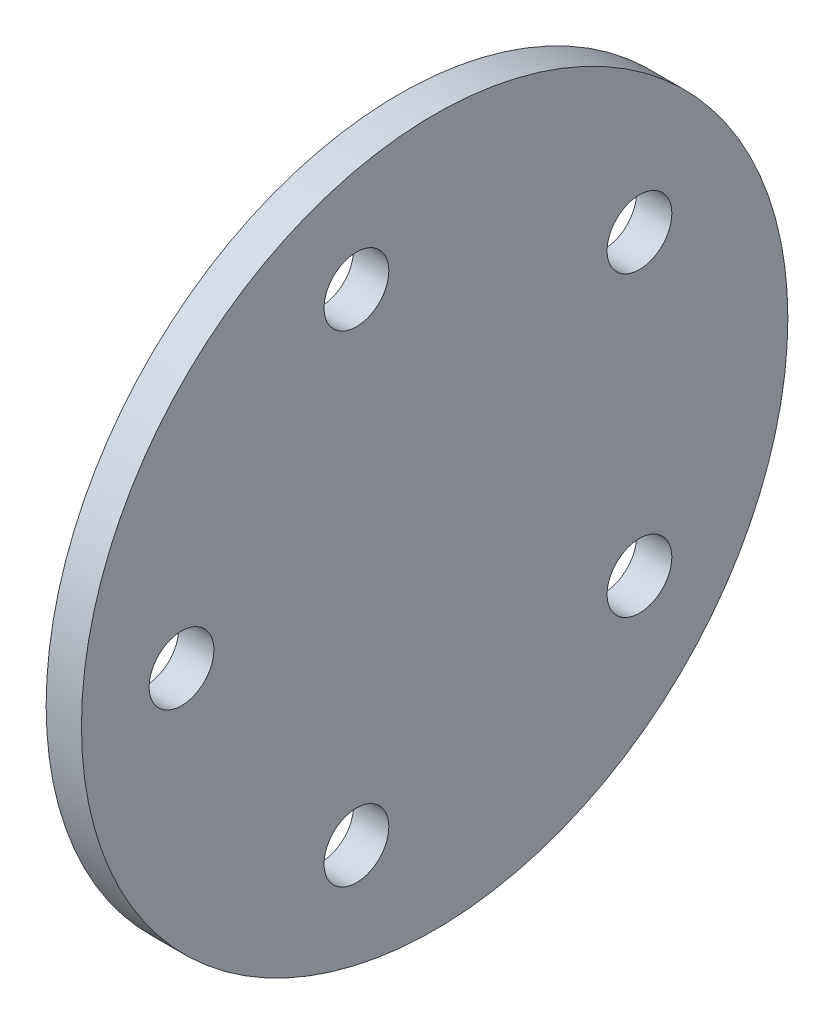
ISO-10303-21;
HEADER;
FILE_DESCRIPTION(('STEP AP214'),'2;1');
FILE_NAME('part.step','',(''),(''),'','','');
FILE_SCHEMA(('AUTOMOTIVE_DESIGN { 1 0 10303 214 1 1 1 1 }'));
ENDSEC;
DATA;
#1=APPLICATION_CONTEXT('core data for automotive mechanical design processes');
#2=APPLICATION_PROTOCOL_DEFINITION('international standard','automotive_design',2000,#1);
#3=PRODUCT_CONTEXT('',#1,'mechanical');
#4=PRODUCT('Part','Part','',(#3));
#5=PRODUCT_RELATED_PRODUCT_CATEGORY('part','',(#4));
#6=PRODUCT_DEFINITION_FORMATION('','',#4);
#7=PRODUCT_DEFINITION_CONTEXT('part definition',#1,'design');
#8=PRODUCT_DEFINITION('design','',#6,#7);
#9=PRODUCT_DEFINITION_SHAPE('','',#8);
#10=(LENGTH_UNIT() NAMED_UNIT(*) SI_UNIT(.MILLI.,.METRE.));
#11=(NAMED_UNIT(*) PLANE_ANGLE_UNIT() SI_UNIT($,.RADIAN.));
#12=(NAMED_UNIT(*) SI_UNIT($,.STERADIAN.) SOLID_ANGLE_UNIT());
#13=UNCERTAINTY_MEASURE_WITH_UNIT(LENGTH_MEASURE(1.E-05),#10,'distance_accuracy_value','');
#14=(GEOMETRIC_REPRESENTATION_CONTEXT(3) GLOBAL_UNCERTAINTY_ASSIGNED_CONTEXT((#13)) GLOBAL_UNIT_ASSIGNED_CONTEXT((#10,
#11,#12)) REPRESENTATION_CONTEXT('',''));
#15=CARTESIAN_POINT('',(0.,0.,0.));
#16=DIRECTION('',(0.,0.,1.));
#17=DIRECTION('',(1.,0.,0.));
#18=AXIS2_PLACEMENT_3D('',#15,#16,#17);
#19=CARTESIAN_POINT('',(3.,0.,0.));
#20=DIRECTION('',(1.,0.,0.));
#21=DIRECTION('',(0.,0.,-1.));
#22=AXIS2_PLACEMENT_3D('',#19,#20,#21);
#23=PLANE('',#22);
#24=CARTESIAN_POINT('',(3.,-12.6373829242883,-17.3938653790613));
#25=DIRECTION('',(1.,0.,0.));
#26=DIRECTION('',(0.,0.,-1.));
#27=AXIS2_PLACEMENT_3D('',#24,#25,#26);
#28=CIRCLE('',#27,2.75);
#29=CARTESIAN_POINT('',(3.,-12.6373829242883,-20.1438653790613));
#30=VERTEX_POINT('',#29);
#31=EDGE_CURVE('E78',#30,#30,#28,.T.);
#32=ORIENTED_EDGE('',*,*,#31,.F.);
#33=EDGE_LOOP('',(#32));
#34=FACE_BOUND('',#33,.T.);
#35=CARTESIAN_POINT('',(3.,20.4477151003458,6.64386537906138));
#36=DIRECTION('',(1.,0.,0.));
#37=DIRECTION('',(0.,0.,-1.));
#38=AXIS2_PLACEMENT_3D('',#35,#36,#37);
#39=CIRCLE('',#38,2.75);
#40=CARTESIAN_POINT('',(3.,20.4477151003458,3.89386537906138));
#41=VERTEX_POINT('',#40);
#42=EDGE_CURVE('E62',#41,#41,#39,.T.);
#43=ORIENTED_EDGE('',*,*,#42,.F.);
#44=EDGE_LOOP('',(#43));
#45=FACE_BOUND('',#44,.T.);
#46=CARTESIAN_POINT('',(3.,0.,0.));
#47=DIRECTION('',(1.,0.,0.));
#48=DIRECTION('',(0.,0.,-1.));
#49=AXIS2_PLACEMENT_3D('',#46,#47,#48);
#50=CIRCLE('',#49,30.);
#51=CARTESIAN_POINT('',(3.,0.,-30.));
#52=VERTEX_POINT('',#51);
#53=EDGE_CURVE('E10',#52,#52,#50,.T.);
#54=ORIENTED_EDGE('',*,*,#53,.T.);
#55=EDGE_LOOP('',(#54));
#56=FACE_BOUND('',#55,.T.);
#57=CARTESIAN_POINT('',(3.,0.,21.5));
#58=DIRECTION('',(1.,0.,0.));
#59=DIRECTION('',(0.,0.,-1.));
#60=AXIS2_PLACEMENT_3D('',#57,#58,#59);
#61=CIRCLE('',#60,2.75);
#62=CARTESIAN_POINT('',(3.,0.,18.75));
#63=VERTEX_POINT('',#62);
#64=EDGE_CURVE('E56',#63,#63,#61,.T.);
#65=ORIENTED_EDGE('',*,*,#64,.F.);
#66=EDGE_LOOP('',(#65));
#67=FACE_BOUND('',#66,.T.);
#68=CARTESIAN_POINT('',(3.,12.6373829242881,-17.3938653790614));
#69=DIRECTION('',(1.,0.,0.));
#70=DIRECTION('',(0.,0.,-1.));
#71=AXIS2_PLACEMENT_3D('',#68,#69,#70);
#72=CIRCLE('',#71,2.75);
#73=CARTESIAN_POINT('',(3.,12.6373829242881,-20.1438653790614));
#74=VERTEX_POINT('',#73);
#75=EDGE_CURVE('E70',#74,#74,#72,.T.);
#76=ORIENTED_EDGE('',*,*,#75,.F.);
#77=EDGE_LOOP('',(#76));
#78=FACE_BOUND('',#77,.T.);
#79=CARTESIAN_POINT('',(3.,-20.4477151003458,6.64386537906153));
#80=DIRECTION('',(1.,0.,0.));
#81=DIRECTION('',(0.,0.,-1.));
#82=AXIS2_PLACEMENT_3D('',#79,#80,#81);
#83=CIRCLE('',#82,2.75);
#84=CARTESIAN_POINT('',(3.,-20.4477151003458,3.89386537906153));
#85=VERTEX_POINT('',#84);
#86=EDGE_CURVE('E86',#85,#85,#83,.T.);
#87=ORIENTED_EDGE('',*,*,#86,.F.);
#88=EDGE_LOOP('',(#87));
#89=FACE_BOUND('',#88,.T.);
#90=ADVANCED_FACE('F43',(#34,#45,#56,#67,#78,#89),#23,.T.);
#91=CARTESIAN_POINT('',(0.,0.,0.));
#92=DIRECTION('',(1.,0.,0.));
#93=DIRECTION('',(0.,0.,-1.));
#94=AXIS2_PLACEMENT_3D('',#91,#92,#93);
#95=PLANE('',#94);
#96=CARTESIAN_POINT('',(0.,0.,0.));
#97=DIRECTION('',(1.,0.,0.));
#98=DIRECTION('',(0.,0.,-1.));
#99=AXIS2_PLACEMENT_3D('',#96,#97,#98);
#100=CIRCLE('',#99,30.);
#101=CARTESIAN_POINT('',(0.,0.,-30.));
#102=VERTEX_POINT('',#101);
#103=EDGE_CURVE('E47',#102,#102,#100,.T.);
#104=ORIENTED_EDGE('',*,*,#103,.F.);
#105=EDGE_LOOP('',(#104));
#106=FACE_BOUND('',#105,.T.);
#107=CARTESIAN_POINT('',(0.,0.,21.5));
#108=DIRECTION('',(1.,0.,0.));
#109=DIRECTION('',(0.,0.,-1.));
#110=AXIS2_PLACEMENT_3D('',#107,#108,#109);
#111=CIRCLE('',#110,2.75);
#112=CARTESIAN_POINT('',(0.,0.,18.75));
#113=VERTEX_POINT('',#112);
#114=EDGE_CURVE('E58',#113,#113,#111,.T.);
#115=ORIENTED_EDGE('',*,*,#114,.T.);
#116=EDGE_LOOP('',(#115));
#117=FACE_BOUND('',#116,.T.);
#118=CARTESIAN_POINT('',(0.,20.4477151003458,6.64386537906138));
#119=DIRECTION('',(1.,0.,0.));
#120=DIRECTION('',(0.,0.,-1.));
#121=AXIS2_PLACEMENT_3D('',#118,#119,#120);
#122=CIRCLE('',#121,2.75);
#123=CARTESIAN_POINT('',(0.,20.4477151003458,3.89386537906138));
#124=VERTEX_POINT('',#123);
#125=EDGE_CURVE('E66',#124,#124,#122,.T.);
#126=ORIENTED_EDGE('',*,*,#125,.T.);
#127=EDGE_LOOP('',(#126));
#128=FACE_BOUND('',#127,.T.);
#129=CARTESIAN_POINT('',(0.,12.6373829242881,-17.3938653790614));
#130=DIRECTION('',(1.,0.,0.));
#131=DIRECTION('',(0.,0.,-1.));
#132=AXIS2_PLACEMENT_3D('',#129,#130,#131);
#133=CIRCLE('',#132,2.75);
#134=CARTESIAN_POINT('',(0.,12.6373829242881,-20.1438653790614));
#135=VERTEX_POINT('',#134);
#136=EDGE_CURVE('E74',#135,#135,#133,.T.);
#137=ORIENTED_EDGE('',*,*,#136,.T.);
#138=EDGE_LOOP('',(#137));
#139=FACE_BOUND('',#138,.T.);
#140=CARTESIAN_POINT('',(0.,-12.6373829242883,-17.3938653790613));
#141=DIRECTION('',(1.,0.,0.));
#142=DIRECTION('',(0.,0.,-1.));
#143=AXIS2_PLACEMENT_3D('',#140,#141,#142);
#144=CIRCLE('',#143,2.75);
#145=CARTESIAN_POINT('',(0.,-12.6373829242883,-20.1438653790613));
#146=VERTEX_POINT('',#145);
#147=EDGE_CURVE('E82',#146,#146,#144,.T.);
#148=ORIENTED_EDGE('',*,*,#147,.T.);
#149=EDGE_LOOP('',(#148));
#150=FACE_BOUND('',#149,.T.);
#151=CARTESIAN_POINT('',(0.,-20.4477151003458,6.64386537906153));
#152=DIRECTION('',(1.,0.,0.));
#153=DIRECTION('',(0.,0.,-1.));
#154=AXIS2_PLACEMENT_3D('',#151,#152,#153);
#155=CIRCLE('',#154,2.75);
#156=CARTESIAN_POINT('',(0.,-20.4477151003458,3.89386537906153));
#157=VERTEX_POINT('',#156);
#158=EDGE_CURVE('E90',#157,#157,#155,.T.);
#159=ORIENTED_EDGE('',*,*,#158,.T.);
#160=EDGE_LOOP('',(#159));
#161=FACE_BOUND('',#160,.T.);
#162=ADVANCED_FACE('F102',(#106,#117,#128,#139,#150,#161),#95,.F.);
#163=CARTESIAN_POINT('',(3.,0.,0.));
#164=DIRECTION('',(-1.,0.,0.));
#165=DIRECTION('',(0.,0.,1.));
#166=AXIS2_PLACEMENT_3D('',#163,#164,#165);
#167=CYLINDRICAL_SURFACE('',#166,30.);
#168=ORIENTED_EDGE('',*,*,#53,.F.);
#169=EDGE_LOOP('',(#168));
#170=FACE_BOUND('',#169,.T.);
#171=ORIENTED_EDGE('',*,*,#103,.T.);
#172=EDGE_LOOP('',(#171));
#173=FACE_BOUND('',#172,.T.);
#174=ADVANCED_FACE('F45',(#170,#173),#167,.T.);
#175=CARTESIAN_POINT('',(3.,0.,21.5));
#176=DIRECTION('',(-1.,0.,0.));
#177=DIRECTION('',(0.,0.,1.));
#178=AXIS2_PLACEMENT_3D('',#175,#176,#177);
#179=CYLINDRICAL_SURFACE('',#178,2.75);
#180=ORIENTED_EDGE('',*,*,#64,.T.);
#181=EDGE_LOOP('',(#180));
#182=FACE_BOUND('',#181,.T.);
#183=ORIENTED_EDGE('',*,*,#114,.F.);
#184=EDGE_LOOP('',(#183));
#185=FACE_BOUND('',#184,.T.);
#186=ADVANCED_FACE('F112',(#182,#185),#179,.F.);
#187=CARTESIAN_POINT('',(3.,20.4477151003458,6.64386537906138));
#188=DIRECTION('',(-1.,0.,0.));
#189=DIRECTION('',(0.,0.,1.));
#190=AXIS2_PLACEMENT_3D('',#187,#188,#189);
#191=CYLINDRICAL_SURFACE('',#190,2.75);
#192=ORIENTED_EDGE('',*,*,#42,.T.);
#193=EDGE_LOOP('',(#192));
#194=FACE_BOUND('',#193,.T.);
#195=ORIENTED_EDGE('',*,*,#125,.F.);
#196=EDGE_LOOP('',(#195));
#197=FACE_BOUND('',#196,.T.);
#198=ADVANCED_FACE('F115',(#194,#197),#191,.F.);
#199=CARTESIAN_POINT('',(3.,12.6373829242881,-17.3938653790614));
#200=DIRECTION('',(-1.,0.,0.));
#201=DIRECTION('',(0.,0.,1.));
#202=AXIS2_PLACEMENT_3D('',#199,#200,#201);
#203=CYLINDRICAL_SURFACE('',#202,2.75);
#204=ORIENTED_EDGE('',*,*,#75,.T.);
#205=EDGE_LOOP('',(#204));
#206=FACE_BOUND('',#205,.T.);
#207=ORIENTED_EDGE('',*,*,#136,.F.);
#208=EDGE_LOOP('',(#207));
#209=FACE_BOUND('',#208,.T.);
#210=ADVANCED_FACE('F119',(#206,#209),#203,.F.);
#211=CARTESIAN_POINT('',(3.,-12.6373829242883,-17.3938653790613));
#212=DIRECTION('',(-1.,0.,0.));
#213=DIRECTION('',(0.,0.,1.));
#214=AXIS2_PLACEMENT_3D('',#211,#212,#213);
#215=CYLINDRICAL_SURFACE('',#214,2.75);
#216=ORIENTED_EDGE('',*,*,#31,.T.);
#217=EDGE_LOOP('',(#216));
#218=FACE_BOUND('',#217,.T.);
#219=ORIENTED_EDGE('',*,*,#147,.F.);
#220=EDGE_LOOP('',(#219));
#221=FACE_BOUND('',#220,.T.);
#222=ADVANCED_FACE('F123',(#218,#221),#215,.F.);
#223=CARTESIAN_POINT('',(3.,-20.4477151003458,6.64386537906153));
#224=DIRECTION('',(-1.,0.,0.));
#225=DIRECTION('',(0.,0.,1.));
#226=AXIS2_PLACEMENT_3D('',#223,#224,#225);
#227=CYLINDRICAL_SURFACE('',#226,2.75);
#228=ORIENTED_EDGE('',*,*,#86,.T.);
#229=EDGE_LOOP('',(#228));
#230=FACE_BOUND('',#229,.T.);
#231=ORIENTED_EDGE('',*,*,#158,.F.);
#232=EDGE_LOOP('',(#231));
#233=FACE_BOUND('',#232,.T.);
#234=ADVANCED_FACE('F98',(#230,#233),#227,.F.);
#235=CLOSED_SHELL('',(#90,#162,#174,#186,#198,#210,#222,#234));
#236=MANIFOLD_SOLID_BREP('B2',#235);
#237=ADVANCED_BREP_SHAPE_REPRESENTATION('',(#18,#236),#14);
#238=SHAPE_DEFINITION_REPRESENTATION(#9,#237);
ENDSEC;
END-ISO-10303-21;
